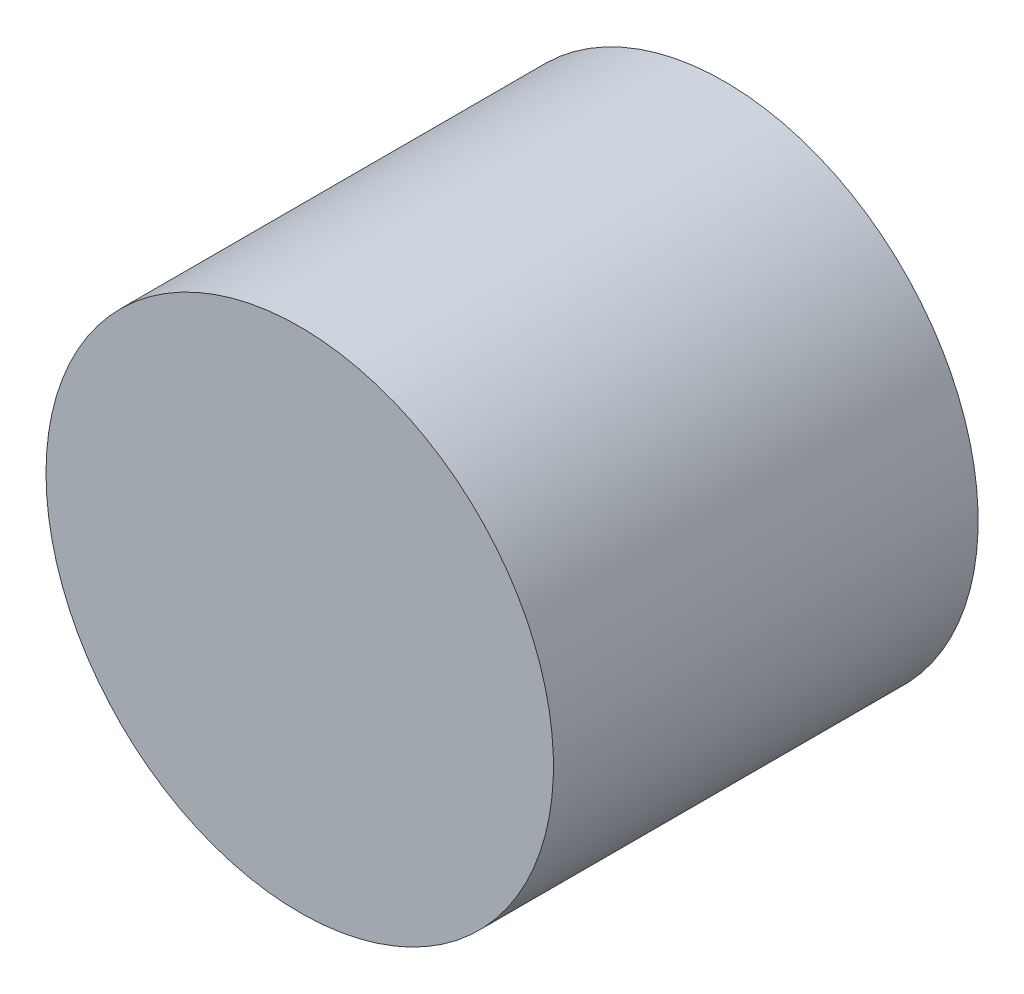
ISO-10303-21;
HEADER;
FILE_DESCRIPTION(('STEP AP214'),'2;1');
FILE_NAME('part.step','',(''),(''),'','','');
FILE_SCHEMA(('AUTOMOTIVE_DESIGN { 1 0 10303 214 1 1 1 1 }'));
ENDSEC;
DATA;
#1=APPLICATION_CONTEXT('core data for automotive mechanical design processes');
#2=APPLICATION_PROTOCOL_DEFINITION('international standard','automotive_design',2000,#1);
#3=PRODUCT_CONTEXT('',#1,'mechanical');
#4=PRODUCT('Part','Part','',(#3));
#5=PRODUCT_RELATED_PRODUCT_CATEGORY('part','',(#4));
#6=PRODUCT_DEFINITION_FORMATION('','',#4);
#7=PRODUCT_DEFINITION_CONTEXT('part definition',#1,'design');
#8=PRODUCT_DEFINITION('design','',#6,#7);
#9=PRODUCT_DEFINITION_SHAPE('','',#8);
#10=(LENGTH_UNIT() NAMED_UNIT(*) SI_UNIT(.MILLI.,.METRE.));
#11=(NAMED_UNIT(*) PLANE_ANGLE_UNIT() SI_UNIT($,.RADIAN.));
#12=(NAMED_UNIT(*) SI_UNIT($,.STERADIAN.) SOLID_ANGLE_UNIT());
#13=UNCERTAINTY_MEASURE_WITH_UNIT(LENGTH_MEASURE(1.E-05),#10,'distance_accuracy_value','');
#14=(GEOMETRIC_REPRESENTATION_CONTEXT(3) GLOBAL_UNCERTAINTY_ASSIGNED_CONTEXT((#13)) GLOBAL_UNIT_ASSIGNED_CONTEXT((#10,
#11,#12)) REPRESENTATION_CONTEXT('',''));
#15=CARTESIAN_POINT('',(0.,0.,0.));
#16=DIRECTION('',(0.,0.,1.));
#17=DIRECTION('',(1.,0.,0.));
#18=AXIS2_PLACEMENT_3D('',#15,#16,#17);
#19=CARTESIAN_POINT('',(-0.739379135703724,0.684339816773041,7.7));
#20=DIRECTION('',(0.,0.,-1.));
#21=DIRECTION('',(-1.,0.,0.));
#22=AXIS2_PLACEMENT_3D('',#19,#20,#21);
#23=CYLINDRICAL_SURFACE('',#22,4.60000000000001);
#24=CARTESIAN_POINT('',(-0.739379135703724,0.684339816773041,7.7));
#25=DIRECTION('',(0.,0.,1.));
#26=DIRECTION('',(1.,0.,0.));
#27=AXIS2_PLACEMENT_3D('',#24,#25,#26);
#28=CIRCLE('',#27,4.60000000000001);
#29=CARTESIAN_POINT('',(-5.33937913570373,0.684339816773041,7.7));
#30=VERTEX_POINT('',#29);
#31=EDGE_CURVE('E10',#30,#30,#28,.T.);
#32=CARTESIAN_POINT('',(-0.739379135703724,0.684339816773041,0.));
#33=DIRECTION('',(0.,0.,1.));
#34=DIRECTION('',(1.,0.,0.));
#35=AXIS2_PLACEMENT_3D('',#32,#33,#34);
#36=CIRCLE('',#35,4.60000000000001);
#37=CARTESIAN_POINT('',(-5.33937913570373,0.684339816773041,0.));
#38=VERTEX_POINT('',#37);
#39=EDGE_CURVE('E38',#38,#38,#36,.T.);
#40=CARTESIAN_POINT('',(-5.33937913570373,0.684339816773041,7.7));
#41=CARTESIAN_POINT('',(-5.33937913570373,0.684339816773041,7.61979166666667));
#42=CARTESIAN_POINT('',(-5.33937913570373,0.684339816773041,7.53958333333333));
#43=CARTESIAN_POINT('',(-5.33937913570373,0.684339816773041,7.37916666666667));
#44=CARTESIAN_POINT('',(-5.33937913570373,0.684339816773041,7.29895833333333));
#45=CARTESIAN_POINT('',(-5.33937913570373,0.684339816773041,7.13854166666667));
#46=CARTESIAN_POINT('',(-5.33937913570373,0.684339816773041,7.05833333333333));
#47=CARTESIAN_POINT('',(-5.33937913570373,0.684339816773041,6.89791666666667));
#48=CARTESIAN_POINT('',(-5.33937913570373,0.684339816773041,6.81770833333333));
#49=CARTESIAN_POINT('',(-5.33937913570373,0.684339816773041,6.65729166666667));
#50=CARTESIAN_POINT('',(-5.33937913570373,0.684339816773041,6.57708333333333));
#51=CARTESIAN_POINT('',(-5.33937913570373,0.684339816773041,6.41666666666667));
#52=CARTESIAN_POINT('',(-5.33937913570373,0.684339816773041,6.33645833333333));
#53=CARTESIAN_POINT('',(-5.33937913570373,0.684339816773041,6.17604166666667));
#54=CARTESIAN_POINT('',(-5.33937913570373,0.684339816773041,6.09583333333333));
#55=CARTESIAN_POINT('',(-5.33937913570373,0.684339816773041,5.93541666666667));
#56=CARTESIAN_POINT('',(-5.33937913570373,0.684339816773041,5.85520833333333));
#57=CARTESIAN_POINT('',(-5.33937913570373,0.684339816773041,5.69479166666667));
#58=CARTESIAN_POINT('',(-5.33937913570373,0.684339816773041,5.61458333333333));
#59=CARTESIAN_POINT('',(-5.33937913570373,0.684339816773041,5.45416666666667));
#60=CARTESIAN_POINT('',(-5.33937913570373,0.684339816773041,5.37395833333333));
#61=CARTESIAN_POINT('',(-5.33937913570373,0.684339816773041,5.21354166666667));
#62=CARTESIAN_POINT('',(-5.33937913570373,0.684339816773041,5.13333333333333));
#63=CARTESIAN_POINT('',(-5.33937913570373,0.684339816773041,4.97291666666667));
#64=CARTESIAN_POINT('',(-5.33937913570373,0.684339816773041,4.89270833333333));
#65=CARTESIAN_POINT('',(-5.33937913570373,0.684339816773041,4.73229166666667));
#66=CARTESIAN_POINT('',(-5.33937913570373,0.684339816773041,4.65208333333333));
#67=CARTESIAN_POINT('',(-5.33937913570373,0.684339816773041,4.49166666666667));
#68=CARTESIAN_POINT('',(-5.33937913570373,0.684339816773041,4.41145833333333));
#69=CARTESIAN_POINT('',(-5.33937913570373,0.684339816773041,4.25104166666667));
#70=CARTESIAN_POINT('',(-5.33937913570373,0.684339816773041,4.17083333333333));
#71=CARTESIAN_POINT('',(-5.33937913570373,0.684339816773041,4.01041666666667));
#72=CARTESIAN_POINT('',(-5.33937913570373,0.684339816773041,3.93020833333333));
#73=CARTESIAN_POINT('',(-5.33937913570373,0.684339816773041,3.76979166666667));
#74=CARTESIAN_POINT('',(-5.33937913570373,0.684339816773041,3.68958333333333));
#75=CARTESIAN_POINT('',(-5.33937913570373,0.684339816773041,3.52916666666667));
#76=CARTESIAN_POINT('',(-5.33937913570373,0.684339816773041,3.44895833333333));
#77=CARTESIAN_POINT('',(-5.33937913570373,0.684339816773041,3.28854166666667));
#78=CARTESIAN_POINT('',(-5.33937913570373,0.684339816773041,3.20833333333333));
#79=CARTESIAN_POINT('',(-5.33937913570373,0.684339816773041,3.04791666666667));
#80=CARTESIAN_POINT('',(-5.33937913570373,0.684339816773041,2.96770833333333));
#81=CARTESIAN_POINT('',(-5.33937913570373,0.684339816773041,2.80729166666667));
#82=CARTESIAN_POINT('',(-5.33937913570373,0.684339816773041,2.72708333333333));
#83=CARTESIAN_POINT('',(-5.33937913570373,0.684339816773041,2.56666666666667));
#84=CARTESIAN_POINT('',(-5.33937913570373,0.684339816773041,2.48645833333333));
#85=CARTESIAN_POINT('',(-5.33937913570373,0.684339816773041,2.32604166666667));
#86=CARTESIAN_POINT('',(-5.33937913570373,0.684339816773041,2.24583333333333));
#87=CARTESIAN_POINT('',(-5.33937913570373,0.684339816773041,2.08541666666667));
#88=CARTESIAN_POINT('',(-5.33937913570373,0.684339816773041,2.00520833333333));
#89=CARTESIAN_POINT('',(-5.33937913570373,0.684339816773041,1.84479166666667));
#90=CARTESIAN_POINT('',(-5.33937913570373,0.684339816773041,1.76458333333333));
#91=CARTESIAN_POINT('',(-5.33937913570373,0.684339816773041,1.60416666666667));
#92=CARTESIAN_POINT('',(-5.33937913570373,0.684339816773041,1.52395833333333));
#93=CARTESIAN_POINT('',(-5.33937913570373,0.684339816773041,1.36354166666667));
#94=CARTESIAN_POINT('',(-5.33937913570373,0.684339816773041,1.28333333333333));
#95=CARTESIAN_POINT('',(-5.33937913570373,0.684339816773041,1.12291666666667));
#96=CARTESIAN_POINT('',(-5.33937913570373,0.684339816773041,1.04270833333333));
#97=CARTESIAN_POINT('',(-5.33937913570373,0.684339816773041,0.882291666666666));
#98=CARTESIAN_POINT('',(-5.33937913570373,0.684339816773041,0.802083333333333));
#99=CARTESIAN_POINT('',(-5.33937913570373,0.684339816773041,0.641666666666666));
#100=CARTESIAN_POINT('',(-5.33937913570373,0.684339816773041,0.561458333333332));
#101=CARTESIAN_POINT('',(-5.33937913570373,0.684339816773041,0.401041666666666));
#102=CARTESIAN_POINT('',(-5.33937913570373,0.684339816773041,0.320833333333333));
#103=CARTESIAN_POINT('',(-5.33937913570373,0.684339816773041,0.160416666666666));
#104=CARTESIAN_POINT('',(-5.33937913570373,0.684339816773041,0.0802083333333325));
#105=CARTESIAN_POINT('',(-5.33937913570373,0.684339816773041,0.));
#106=B_SPLINE_CURVE_WITH_KNOTS('',3,(#40,#41,#42,#43,#44,#45,#46,#47,#48,#49,#50,#51,#52,#53,
#54,#55,#56,#57,#58,#59,#60,#61,#62,#63,#64,#65,#66,#67,#68,#69,#70,#71,#72,#73,#74,#75,#76,#77,
#78,#79,#80,#81,#82,#83,#84,#85,#86,#87,#88,#89,#90,#91,#92,#93,#94,#95,#96,#97,#98,#99,#100,
#101,#102,#103,#104,#105),.UNSPECIFIED.,.F.,.F.,(4,2,2,2,2,2,2,2,2,2,2,2,2,2,2,2,2,2,2,2,2,2,2,
2,2,2,2,2,2,2,2,2,4),(0.,0.240625,0.481250000000001,0.721875,0.962500000000001,1.203125,1.44375,
1.684375,1.925,2.165625,2.40625,2.646875,2.8875,3.128125,3.36875,3.609375,3.85,4.090625,4.33125,
4.571875,4.8125,5.053125,5.29375,5.534375,5.775,6.015625,6.25625,6.496875,6.7375,6.978125,
7.21875,7.459375,7.7),.UNSPECIFIED.);
#107=EDGE_CURVE('BSEAM35',#30,#38,#106,.T.);
#108=ORIENTED_EDGE('',*,*,#31,.F.);
#109=ORIENTED_EDGE('',*,*,#39,.T.);
#110=ORIENTED_EDGE('',*,*,#107,.T.);
#111=ORIENTED_EDGE('',*,*,#107,.F.);
#112=EDGE_LOOP('',(#108,#110,#109,#111));
#113=FACE_BOUND('',#112,.T.);
#114=ADVANCED_FACE('F35',(#113),#23,.T.);
#115=CARTESIAN_POINT('',(-0.739379135703724,0.684339816773041,7.7));
#116=DIRECTION('',(0.,0.,1.));
#117=DIRECTION('',(1.,0.,0.));
#118=AXIS2_PLACEMENT_3D('',#115,#116,#117);
#119=PLANE('',#118);
#120=ORIENTED_EDGE('',*,*,#31,.T.);
#121=EDGE_LOOP('',(#120));
#122=FACE_BOUND('',#121,.T.);
#123=ADVANCED_FACE('F50',(#122),#119,.T.);
#124=CARTESIAN_POINT('',(-0.739379135703724,0.684339816773041,0.));
#125=DIRECTION('',(0.,0.,1.));
#126=DIRECTION('',(1.,0.,0.));
#127=AXIS2_PLACEMENT_3D('',#124,#125,#126);
#128=PLANE('',#127);
#129=ORIENTED_EDGE('',*,*,#39,.F.);
#130=EDGE_LOOP('',(#129));
#131=FACE_BOUND('',#130,.T.);
#132=ADVANCED_FACE('F48',(#131),#128,.F.);
#133=CLOSED_SHELL('',(#114,#123,#132));
#134=MANIFOLD_SOLID_BREP('B2',#133);
#135=ADVANCED_BREP_SHAPE_REPRESENTATION('',(#18,#134),#14);
#136=SHAPE_DEFINITION_REPRESENTATION(#9,#135);
ENDSEC;
END-ISO-10303-21;
